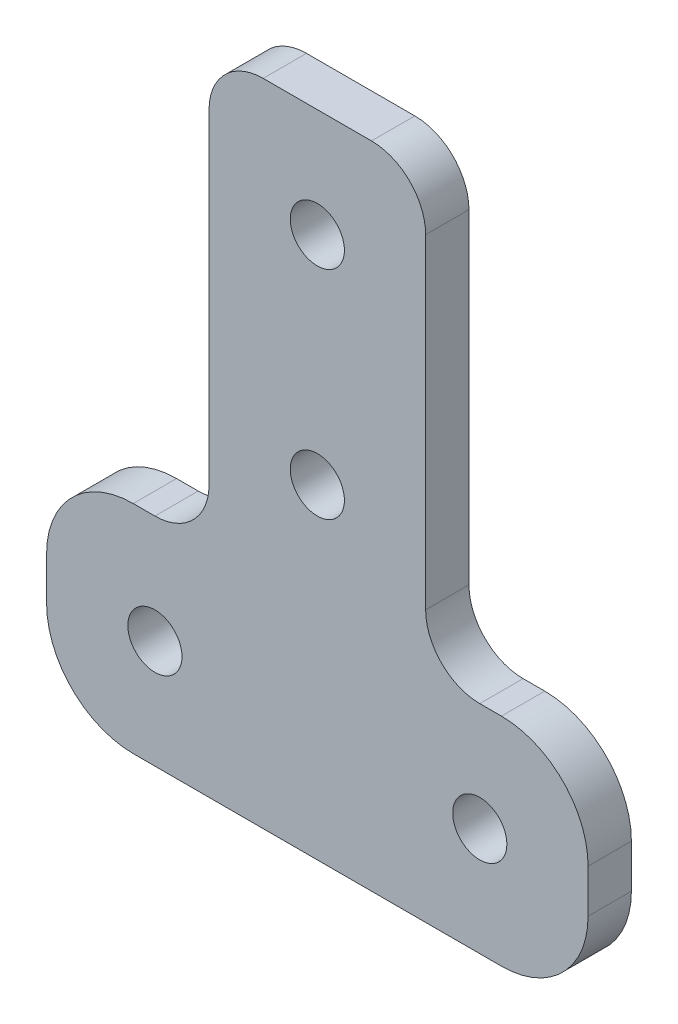
ISO-10303-21;
HEADER;
FILE_DESCRIPTION(('STEP AP214'),'2;1');
FILE_NAME('part.step','',(''),(''),'','','');
FILE_SCHEMA(('AUTOMOTIVE_DESIGN { 1 0 10303 214 1 1 1 1 }'));
ENDSEC;
DATA;
#1=APPLICATION_CONTEXT('core data for automotive mechanical design processes');
#2=APPLICATION_PROTOCOL_DEFINITION('international standard','automotive_design',2000,#1);
#3=PRODUCT_CONTEXT('',#1,'mechanical');
#4=PRODUCT('Part','Part','',(#3));
#5=PRODUCT_RELATED_PRODUCT_CATEGORY('part','',(#4));
#6=PRODUCT_DEFINITION_FORMATION('','',#4);
#7=PRODUCT_DEFINITION_CONTEXT('part definition',#1,'design');
#8=PRODUCT_DEFINITION('design','',#6,#7);
#9=PRODUCT_DEFINITION_SHAPE('','',#8);
#10=(LENGTH_UNIT() NAMED_UNIT(*) SI_UNIT(.MILLI.,.METRE.));
#11=(NAMED_UNIT(*) PLANE_ANGLE_UNIT() SI_UNIT($,.RADIAN.));
#12=(NAMED_UNIT(*) SI_UNIT($,.STERADIAN.) SOLID_ANGLE_UNIT());
#13=UNCERTAINTY_MEASURE_WITH_UNIT(LENGTH_MEASURE(1.E-05),#10,'distance_accuracy_value','');
#14=(GEOMETRIC_REPRESENTATION_CONTEXT(3) GLOBAL_UNCERTAINTY_ASSIGNED_CONTEXT((#13)) GLOBAL_UNIT_ASSIGNED_CONTEXT((#10,
#11,#12)) REPRESENTATION_CONTEXT('',''));
#15=CARTESIAN_POINT('',(0.,0.,0.));
#16=DIRECTION('',(0.,0.,1.));
#17=DIRECTION('',(1.,0.,0.));
#18=AXIS2_PLACEMENT_3D('',#15,#16,#17);
#19=CARTESIAN_POINT('',(0.,0.,4.));
#20=DIRECTION('',(0.,0.,-1.));
#21=DIRECTION('',(-1.,0.,0.));
#22=AXIS2_PLACEMENT_3D('',#19,#20,#21);
#23=PLANE('',#22);
#24=DIRECTION('',(1.,0.,0.));
#25=VECTOR('',#24,1.);
#26=CARTESIAN_POINT('',(25.,0.,4.));
#27=LINE('',#26,#25);
#28=CARTESIAN_POINT('',(-17.,0.,4.));
#29=VERTEX_POINT('',#28);
#30=CARTESIAN_POINT('',(17.,0.,4.));
#31=VERTEX_POINT('',#30);
#32=EDGE_CURVE('E214',#29,#31,#27,.T.);
#33=ORIENTED_EDGE('',*,*,#32,.T.);
#34=CARTESIAN_POINT('',(17.,7.99999999999999,4.));
#35=DIRECTION('',(0.,0.,-1.));
#36=DIRECTION('',(-1.,0.,0.));
#37=AXIS2_PLACEMENT_3D('',#34,#35,#36);
#38=CIRCLE('',#37,8.);
#39=CARTESIAN_POINT('',(25.,7.99999999999999,4.));
#40=VERTEX_POINT('',#39);
#41=EDGE_CURVE('E288',#31,#40,#38,.F.);
#42=ORIENTED_EDGE('',*,*,#41,.T.);
#43=DIRECTION('',(0.,1.,0.));
#44=VECTOR('',#43,1.);
#45=CARTESIAN_POINT('',(25.,20.,4.));
#46=LINE('',#45,#44);
#47=CARTESIAN_POINT('',(25.,12.,4.));
#48=VERTEX_POINT('',#47);
#49=EDGE_CURVE('E212',#40,#48,#46,.T.);
#50=ORIENTED_EDGE('',*,*,#49,.T.);
#51=CARTESIAN_POINT('',(17.,12.,4.));
#52=DIRECTION('',(0.,0.,-1.));
#53=DIRECTION('',(-1.,0.,0.));
#54=AXIS2_PLACEMENT_3D('',#51,#52,#53);
#55=CIRCLE('',#54,8.);
#56=CARTESIAN_POINT('',(17.,20.,4.));
#57=VERTEX_POINT('',#56);
#58=EDGE_CURVE('E55',#48,#57,#55,.F.);
#59=ORIENTED_EDGE('',*,*,#58,.T.);
#60=DIRECTION('',(-1.,0.,0.));
#61=VECTOR('',#60,1.);
#62=CARTESIAN_POINT('',(10.,20.,4.));
#63=LINE('',#62,#61);
#64=CARTESIAN_POINT('',(15.,20.,4.));
#65=VERTEX_POINT('',#64);
#66=EDGE_CURVE('E319',#57,#65,#63,.T.);
#67=ORIENTED_EDGE('',*,*,#66,.T.);
#68=CARTESIAN_POINT('',(15.,25.,4.));
#69=DIRECTION('',(0.,0.,-1.));
#70=DIRECTION('',(-1.,0.,0.));
#71=AXIS2_PLACEMENT_3D('',#68,#69,#70);
#72=CIRCLE('',#71,5.);
#73=CARTESIAN_POINT('',(10.,25.,4.));
#74=VERTEX_POINT('',#73);
#75=EDGE_CURVE('E166',#65,#74,#72,.T.);
#76=ORIENTED_EDGE('',*,*,#75,.T.);
#77=DIRECTION('',(0.,1.,0.));
#78=VECTOR('',#77,1.);
#79=CARTESIAN_POINT('',(10.,60.,4.));
#80=LINE('',#79,#78);
#81=CARTESIAN_POINT('',(10.,55.,4.));
#82=VERTEX_POINT('',#81);
#83=EDGE_CURVE('E176',#74,#82,#80,.T.);
#84=ORIENTED_EDGE('',*,*,#83,.T.);
#85=CARTESIAN_POINT('',(5.,55.,4.));
#86=DIRECTION('',(0.,0.,-1.));
#87=DIRECTION('',(-1.,0.,0.));
#88=AXIS2_PLACEMENT_3D('',#85,#86,#87);
#89=CIRCLE('',#88,5.);
#90=CARTESIAN_POINT('',(4.99999999999999,60.,4.));
#91=VERTEX_POINT('',#90);
#92=EDGE_CURVE('E233',#82,#91,#89,.F.);
#93=ORIENTED_EDGE('',*,*,#92,.T.);
#94=DIRECTION('',(-1.,0.,0.));
#95=VECTOR('',#94,1.);
#96=CARTESIAN_POINT('',(-10.,60.,4.));
#97=LINE('',#96,#95);
#98=CARTESIAN_POINT('',(-5.00000000000001,60.,4.));
#99=VERTEX_POINT('',#98);
#100=EDGE_CURVE('E313',#91,#99,#97,.T.);
#101=ORIENTED_EDGE('',*,*,#100,.T.);
#102=CARTESIAN_POINT('',(-5.,55.,4.));
#103=DIRECTION('',(0.,0.,-1.));
#104=DIRECTION('',(-1.,0.,0.));
#105=AXIS2_PLACEMENT_3D('',#102,#103,#104);
#106=CIRCLE('',#105,5.);
#107=CARTESIAN_POINT('',(-10.,55.,4.));
#108=VERTEX_POINT('',#107);
#109=EDGE_CURVE('E230',#99,#108,#106,.F.);
#110=ORIENTED_EDGE('',*,*,#109,.T.);
#111=DIRECTION('',(0.,-1.,0.));
#112=VECTOR('',#111,1.);
#113=CARTESIAN_POINT('',(-10.,60.,4.));
#114=LINE('',#113,#112);
#115=CARTESIAN_POINT('',(-10.,25.,4.));
#116=VERTEX_POINT('',#115);
#117=EDGE_CURVE('E309',#108,#116,#114,.T.);
#118=ORIENTED_EDGE('',*,*,#117,.T.);
#119=CARTESIAN_POINT('',(-15.,25.,4.));
#120=DIRECTION('',(0.,0.,-1.));
#121=DIRECTION('',(-1.,0.,0.));
#122=AXIS2_PLACEMENT_3D('',#119,#120,#121);
#123=CIRCLE('',#122,5.);
#124=CARTESIAN_POINT('',(-15.,20.,4.));
#125=VERTEX_POINT('',#124);
#126=EDGE_CURVE('E251',#116,#125,#123,.T.);
#127=ORIENTED_EDGE('',*,*,#126,.T.);
#128=DIRECTION('',(-1.,0.,0.));
#129=VECTOR('',#128,1.);
#130=CARTESIAN_POINT('',(-10.,20.,4.));
#131=LINE('',#130,#129);
#132=CARTESIAN_POINT('',(-17.,20.,4.));
#133=VERTEX_POINT('',#132);
#134=EDGE_CURVE('E305',#125,#133,#131,.T.);
#135=ORIENTED_EDGE('',*,*,#134,.T.);
#136=CARTESIAN_POINT('',(-17.,12.,4.));
#137=DIRECTION('',(0.,0.,-1.));
#138=DIRECTION('',(-1.,0.,0.));
#139=AXIS2_PLACEMENT_3D('',#136,#137,#138);
#140=CIRCLE('',#139,8.);
#141=CARTESIAN_POINT('',(-25.,12.,4.));
#142=VERTEX_POINT('',#141);
#143=EDGE_CURVE('E280',#133,#142,#140,.F.);
#144=ORIENTED_EDGE('',*,*,#143,.T.);
#145=DIRECTION('',(0.,-1.,0.));
#146=VECTOR('',#145,1.);
#147=CARTESIAN_POINT('',(-25.,20.,4.));
#148=LINE('',#147,#146);
#149=CARTESIAN_POINT('',(-25.,7.99999999999999,4.));
#150=VERTEX_POINT('',#149);
#151=EDGE_CURVE('E302',#142,#150,#148,.T.);
#152=ORIENTED_EDGE('',*,*,#151,.T.);
#153=CARTESIAN_POINT('',(-17.,7.99999999999999,4.));
#154=DIRECTION('',(0.,0.,-1.));
#155=DIRECTION('',(-1.,0.,0.));
#156=AXIS2_PLACEMENT_3D('',#153,#154,#155);
#157=CIRCLE('',#156,8.);
#158=EDGE_CURVE('E283',#150,#29,#157,.F.);
#159=ORIENTED_EDGE('',*,*,#158,.T.);
#160=EDGE_LOOP('',(#33,#42,#50,#59,#67,#76,#84,#93,#101,#110,#118,#127,#135,#144,#152,#159));
#161=FACE_BOUND('',#160,.T.);
#162=CARTESIAN_POINT('',(0.,50.,4.));
#163=DIRECTION('',(0.,0.,1.));
#164=DIRECTION('',(1.,0.,0.));
#165=AXIS2_PLACEMENT_3D('',#162,#163,#164);
#166=CIRCLE('',#165,2.5);
#167=CARTESIAN_POINT('',(2.5,50.,4.));
#168=VERTEX_POINT('',#167);
#169=EDGE_CURVE('E330',#168,#168,#166,.T.);
#170=ORIENTED_EDGE('',*,*,#169,.F.);
#171=EDGE_LOOP('',(#170));
#172=FACE_BOUND('',#171,.T.);
#173=CARTESIAN_POINT('',(0.,30.,4.));
#174=DIRECTION('',(0.,0.,1.));
#175=DIRECTION('',(1.,0.,0.));
#176=AXIS2_PLACEMENT_3D('',#173,#174,#175);
#177=CIRCLE('',#176,2.5);
#178=CARTESIAN_POINT('',(2.5,30.,4.));
#179=VERTEX_POINT('',#178);
#180=EDGE_CURVE('E339',#179,#179,#177,.T.);
#181=ORIENTED_EDGE('',*,*,#180,.F.);
#182=EDGE_LOOP('',(#181));
#183=FACE_BOUND('',#182,.T.);
#184=CARTESIAN_POINT('',(15.,10.,4.));
#185=DIRECTION('',(0.,0.,1.));
#186=DIRECTION('',(1.,0.,0.));
#187=AXIS2_PLACEMENT_3D('',#184,#185,#186);
#188=CIRCLE('',#187,2.5);
#189=CARTESIAN_POINT('',(17.5,10.,4.));
#190=VERTEX_POINT('',#189);
#191=EDGE_CURVE('E345',#190,#190,#188,.T.);
#192=ORIENTED_EDGE('',*,*,#191,.F.);
#193=EDGE_LOOP('',(#192));
#194=FACE_BOUND('',#193,.T.);
#195=CARTESIAN_POINT('',(-15.,9.99999999999999,4.));
#196=DIRECTION('',(0.,0.,1.));
#197=DIRECTION('',(1.,0.,0.));
#198=AXIS2_PLACEMENT_3D('',#195,#196,#197);
#199=CIRCLE('',#198,2.5);
#200=CARTESIAN_POINT('',(-12.5,9.99999999999999,4.));
#201=VERTEX_POINT('',#200);
#202=EDGE_CURVE('E353',#201,#201,#199,.T.);
#203=ORIENTED_EDGE('',*,*,#202,.F.);
#204=EDGE_LOOP('',(#203));
#205=FACE_BOUND('',#204,.T.);
#206=ADVANCED_FACE('F39',(#161,#172,#183,#194,#205),#23,.F.);
#207=CARTESIAN_POINT('',(0.,0.,0.));
#208=DIRECTION('',(0.,0.,-1.));
#209=DIRECTION('',(-1.,0.,0.));
#210=AXIS2_PLACEMENT_3D('',#207,#208,#209);
#211=PLANE('',#210);
#212=CARTESIAN_POINT('',(15.,10.,0.));
#213=DIRECTION('',(0.,0.,1.));
#214=DIRECTION('',(1.,0.,0.));
#215=AXIS2_PLACEMENT_3D('',#212,#213,#214);
#216=CIRCLE('',#215,2.5);
#217=CARTESIAN_POINT('',(17.5,10.,0.));
#218=VERTEX_POINT('',#217);
#219=EDGE_CURVE('E349',#218,#218,#216,.T.);
#220=ORIENTED_EDGE('',*,*,#219,.T.);
#221=EDGE_LOOP('',(#220));
#222=FACE_BOUND('',#221,.T.);
#223=CARTESIAN_POINT('',(0.,50.,0.));
#224=DIRECTION('',(0.,0.,1.));
#225=DIRECTION('',(1.,0.,0.));
#226=AXIS2_PLACEMENT_3D('',#223,#224,#225);
#227=CIRCLE('',#226,2.5);
#228=CARTESIAN_POINT('',(2.5,50.,0.));
#229=VERTEX_POINT('',#228);
#230=EDGE_CURVE('E326',#229,#229,#227,.T.);
#231=ORIENTED_EDGE('',*,*,#230,.T.);
#232=EDGE_LOOP('',(#231));
#233=FACE_BOUND('',#232,.T.);
#234=DIRECTION('',(0.,1.,0.));
#235=VECTOR('',#234,1.);
#236=CARTESIAN_POINT('',(25.,20.,0.));
#237=LINE('',#236,#235);
#238=CARTESIAN_POINT('',(25.,7.99999999999999,0.));
#239=VERTEX_POINT('',#238);
#240=CARTESIAN_POINT('',(25.,12.,0.));
#241=VERTEX_POINT('',#240);
#242=EDGE_CURVE('E194',#239,#241,#237,.T.);
#243=ORIENTED_EDGE('',*,*,#242,.F.);
#244=CARTESIAN_POINT('',(17.,7.99999999999999,0.));
#245=DIRECTION('',(0.,0.,-1.));
#246=DIRECTION('',(-1.,0.,0.));
#247=AXIS2_PLACEMENT_3D('',#244,#245,#246);
#248=CIRCLE('',#247,8.);
#249=CARTESIAN_POINT('',(17.,0.,0.));
#250=VERTEX_POINT('',#249);
#251=EDGE_CURVE('E270',#239,#250,#248,.T.);
#252=ORIENTED_EDGE('',*,*,#251,.T.);
#253=DIRECTION('',(1.,0.,0.));
#254=VECTOR('',#253,1.);
#255=CARTESIAN_POINT('',(25.,0.,0.));
#256=LINE('',#255,#254);
#257=CARTESIAN_POINT('',(-17.,0.,0.));
#258=VERTEX_POINT('',#257);
#259=EDGE_CURVE('E208',#258,#250,#256,.T.);
#260=ORIENTED_EDGE('',*,*,#259,.F.);
#261=CARTESIAN_POINT('',(-17.,7.99999999999999,0.));
#262=DIRECTION('',(0.,0.,-1.));
#263=DIRECTION('',(-1.,0.,0.));
#264=AXIS2_PLACEMENT_3D('',#261,#262,#263);
#265=CIRCLE('',#264,8.);
#266=CARTESIAN_POINT('',(-25.,7.99999999999999,0.));
#267=VERTEX_POINT('',#266);
#268=EDGE_CURVE('E264',#258,#267,#265,.T.);
#269=ORIENTED_EDGE('',*,*,#268,.T.);
#270=DIRECTION('',(0.,-1.,0.));
#271=VECTOR('',#270,1.);
#272=CARTESIAN_POINT('',(-25.,20.,0.));
#273=LINE('',#272,#271);
#274=CARTESIAN_POINT('',(-25.,12.,0.));
#275=VERTEX_POINT('',#274);
#276=EDGE_CURVE('E205',#275,#267,#273,.T.);
#277=ORIENTED_EDGE('',*,*,#276,.F.);
#278=CARTESIAN_POINT('',(-17.,12.,0.));
#279=DIRECTION('',(0.,0.,-1.));
#280=DIRECTION('',(-1.,0.,0.));
#281=AXIS2_PLACEMENT_3D('',#278,#279,#280);
#282=CIRCLE('',#281,8.);
#283=CARTESIAN_POINT('',(-17.,20.,0.));
#284=VERTEX_POINT('',#283);
#285=EDGE_CURVE('E261',#275,#284,#282,.T.);
#286=ORIENTED_EDGE('',*,*,#285,.T.);
#287=DIRECTION('',(-1.,0.,0.));
#288=VECTOR('',#287,1.);
#289=CARTESIAN_POINT('',(-10.,20.,0.));
#290=LINE('',#289,#288);
#291=CARTESIAN_POINT('',(-15.,20.,0.));
#292=VERTEX_POINT('',#291);
#293=EDGE_CURVE('E201',#292,#284,#290,.T.);
#294=ORIENTED_EDGE('',*,*,#293,.F.);
#295=CARTESIAN_POINT('',(-15.,25.,0.));
#296=DIRECTION('',(0.,0.,-1.));
#297=DIRECTION('',(-1.,0.,0.));
#298=AXIS2_PLACEMENT_3D('',#295,#296,#297);
#299=CIRCLE('',#298,5.);
#300=CARTESIAN_POINT('',(-10.,25.,0.));
#301=VERTEX_POINT('',#300);
#302=EDGE_CURVE('E248',#292,#301,#299,.F.);
#303=ORIENTED_EDGE('',*,*,#302,.T.);
#304=DIRECTION('',(0.,-1.,0.));
#305=VECTOR('',#304,1.);
#306=CARTESIAN_POINT('',(-10.,60.,0.));
#307=LINE('',#306,#305);
#308=CARTESIAN_POINT('',(-10.,55.,0.));
#309=VERTEX_POINT('',#308);
#310=EDGE_CURVE('E192',#309,#301,#307,.T.);
#311=ORIENTED_EDGE('',*,*,#310,.F.);
#312=CARTESIAN_POINT('',(-5.,55.,0.));
#313=DIRECTION('',(0.,0.,-1.));
#314=DIRECTION('',(-1.,0.,0.));
#315=AXIS2_PLACEMENT_3D('',#312,#313,#314);
#316=CIRCLE('',#315,5.);
#317=CARTESIAN_POINT('',(-5.00000000000001,60.,0.));
#318=VERTEX_POINT('',#317);
#319=EDGE_CURVE('E225',#309,#318,#316,.T.);
#320=ORIENTED_EDGE('',*,*,#319,.T.);
#321=DIRECTION('',(-1.,0.,0.));
#322=VECTOR('',#321,1.);
#323=CARTESIAN_POINT('',(-10.,60.,0.));
#324=LINE('',#323,#322);
#325=CARTESIAN_POINT('',(4.99999999999999,60.,0.));
#326=VERTEX_POINT('',#325);
#327=EDGE_CURVE('E186',#326,#318,#324,.T.);
#328=ORIENTED_EDGE('',*,*,#327,.F.);
#329=CARTESIAN_POINT('',(5.,55.,0.));
#330=DIRECTION('',(0.,0.,-1.));
#331=DIRECTION('',(-1.,0.,0.));
#332=AXIS2_PLACEMENT_3D('',#329,#330,#331);
#333=CIRCLE('',#332,5.);
#334=CARTESIAN_POINT('',(10.,55.,0.));
#335=VERTEX_POINT('',#334);
#336=EDGE_CURVE('E184',#326,#335,#333,.T.);
#337=ORIENTED_EDGE('',*,*,#336,.T.);
#338=DIRECTION('',(0.,1.,0.));
#339=VECTOR('',#338,1.);
#340=CARTESIAN_POINT('',(10.,60.,0.));
#341=LINE('',#340,#339);
#342=CARTESIAN_POINT('',(10.,25.,0.));
#343=VERTEX_POINT('',#342);
#344=EDGE_CURVE('E173',#343,#335,#341,.T.);
#345=ORIENTED_EDGE('',*,*,#344,.F.);
#346=CARTESIAN_POINT('',(15.,25.,0.));
#347=DIRECTION('',(0.,0.,-1.));
#348=DIRECTION('',(-1.,0.,0.));
#349=AXIS2_PLACEMENT_3D('',#346,#347,#348);
#350=CIRCLE('',#349,5.);
#351=CARTESIAN_POINT('',(15.,20.,0.));
#352=VERTEX_POINT('',#351);
#353=EDGE_CURVE('E155',#343,#352,#350,.F.);
#354=ORIENTED_EDGE('',*,*,#353,.T.);
#355=DIRECTION('',(-1.,0.,0.));
#356=VECTOR('',#355,1.);
#357=CARTESIAN_POINT('',(10.,20.,0.));
#358=LINE('',#357,#356);
#359=CARTESIAN_POINT('',(17.,20.,0.));
#360=VERTEX_POINT('',#359);
#361=EDGE_CURVE('E187',#360,#352,#358,.T.);
#362=ORIENTED_EDGE('',*,*,#361,.F.);
#363=CARTESIAN_POINT('',(17.,12.,0.));
#364=DIRECTION('',(0.,0.,-1.));
#365=DIRECTION('',(-1.,0.,0.));
#366=AXIS2_PLACEMENT_3D('',#363,#364,#365);
#367=CIRCLE('',#366,8.);
#368=EDGE_CURVE('E267',#360,#241,#367,.T.);
#369=ORIENTED_EDGE('',*,*,#368,.T.);
#370=EDGE_LOOP('',(#243,#252,#260,#269,#277,#286,#294,#303,#311,#320,#328,#337,#345,#354,#362,#369));
#371=FACE_BOUND('',#370,.T.);
#372=CARTESIAN_POINT('',(0.,30.,0.));
#373=DIRECTION('',(0.,0.,1.));
#374=DIRECTION('',(1.,0.,0.));
#375=AXIS2_PLACEMENT_3D('',#372,#373,#374);
#376=CIRCLE('',#375,2.5);
#377=CARTESIAN_POINT('',(2.5,30.,0.));
#378=VERTEX_POINT('',#377);
#379=EDGE_CURVE('E341',#378,#378,#376,.T.);
#380=ORIENTED_EDGE('',*,*,#379,.T.);
#381=EDGE_LOOP('',(#380));
#382=FACE_BOUND('',#381,.T.);
#383=CARTESIAN_POINT('',(-15.,9.99999999999999,0.));
#384=DIRECTION('',(0.,0.,1.));
#385=DIRECTION('',(1.,0.,0.));
#386=AXIS2_PLACEMENT_3D('',#383,#384,#385);
#387=CIRCLE('',#386,2.5);
#388=CARTESIAN_POINT('',(-12.5,9.99999999999999,0.));
#389=VERTEX_POINT('',#388);
#390=EDGE_CURVE('E357',#389,#389,#387,.T.);
#391=ORIENTED_EDGE('',*,*,#390,.T.);
#392=EDGE_LOOP('',(#391));
#393=FACE_BOUND('',#392,.T.);
#394=ADVANCED_FACE('F181',(#222,#233,#371,#382,#393),#211,.T.);
#395=CARTESIAN_POINT('',(25.,20.,4.));
#396=DIRECTION('',(-1.,0.,0.));
#397=DIRECTION('',(0.,-1.,0.));
#398=AXIS2_PLACEMENT_3D('',#395,#396,#397);
#399=PLANE('',#398);
#400=ORIENTED_EDGE('',*,*,#49,.F.);
#401=DIRECTION('',(0.,0.,-1.));
#402=VECTOR('',#401,1.);
#403=CARTESIAN_POINT('',(25.,7.99999999999999,4.));
#404=LINE('',#403,#402);
#405=EDGE_CURVE('E257',#40,#239,#404,.T.);
#406=ORIENTED_EDGE('',*,*,#405,.T.);
#407=ORIENTED_EDGE('',*,*,#242,.T.);
#408=DIRECTION('',(0.,0.,-1.));
#409=VECTOR('',#408,1.);
#410=CARTESIAN_POINT('',(25.,12.,4.));
#411=LINE('',#410,#409);
#412=EDGE_CURVE('E254',#241,#48,#411,.F.);
#413=ORIENTED_EDGE('',*,*,#412,.T.);
#414=EDGE_LOOP('',(#400,#406,#407,#413));
#415=FACE_BOUND('',#414,.T.);
#416=ADVANCED_FACE('F373',(#415),#399,.F.);
#417=CARTESIAN_POINT('',(10.,20.,4.));
#418=DIRECTION('',(0.,-1.,0.));
#419=DIRECTION('',(0.,0.,-1.));
#420=AXIS2_PLACEMENT_3D('',#417,#418,#419);
#421=PLANE('',#420);
#422=ORIENTED_EDGE('',*,*,#66,.F.);
#423=DIRECTION('',(0.,0.,-1.));
#424=VECTOR('',#423,1.);
#425=CARTESIAN_POINT('',(17.,20.,4.));
#426=LINE('',#425,#424);
#427=EDGE_CURVE('E291',#57,#360,#426,.T.);
#428=ORIENTED_EDGE('',*,*,#427,.T.);
#429=ORIENTED_EDGE('',*,*,#361,.T.);
#430=DIRECTION('',(0.,0.,-1.));
#431=VECTOR('',#430,1.);
#432=CARTESIAN_POINT('',(15.,20.,4.));
#433=LINE('',#432,#431);
#434=EDGE_CURVE('E161',#352,#65,#433,.F.);
#435=ORIENTED_EDGE('',*,*,#434,.T.);
#436=EDGE_LOOP('',(#422,#428,#429,#435));
#437=FACE_BOUND('',#436,.T.);
#438=ADVANCED_FACE('F402',(#437),#421,.F.);
#439=CARTESIAN_POINT('',(10.,60.,4.));
#440=DIRECTION('',(-1.,0.,0.));
#441=DIRECTION('',(0.,-1.,0.));
#442=AXIS2_PLACEMENT_3D('',#439,#440,#441);
#443=PLANE('',#442);
#444=ORIENTED_EDGE('',*,*,#83,.F.);
#445=DIRECTION('',(0.,0.,-1.));
#446=VECTOR('',#445,1.);
#447=CARTESIAN_POINT('',(10.,25.,0.));
#448=LINE('',#447,#446);
#449=EDGE_CURVE('E159',#74,#343,#448,.T.);
#450=ORIENTED_EDGE('',*,*,#449,.T.);
#451=ORIENTED_EDGE('',*,*,#344,.T.);
#452=DIRECTION('',(0.,0.,-1.));
#453=VECTOR('',#452,1.);
#454=CARTESIAN_POINT('',(10.,55.,4.));
#455=LINE('',#454,#453);
#456=EDGE_CURVE('E178',#335,#82,#455,.F.);
#457=ORIENTED_EDGE('',*,*,#456,.T.);
#458=EDGE_LOOP('',(#444,#450,#451,#457));
#459=FACE_BOUND('',#458,.T.);
#460=ADVANCED_FACE('F172',(#459),#443,.F.);
#461=CARTESIAN_POINT('',(-10.,60.,4.));
#462=DIRECTION('',(0.,-1.,0.));
#463=DIRECTION('',(1.,0.,0.));
#464=AXIS2_PLACEMENT_3D('',#461,#462,#463);
#465=PLANE('',#464);
#466=ORIENTED_EDGE('',*,*,#100,.F.);
#467=DIRECTION('',(0.,0.,-1.));
#468=VECTOR('',#467,1.);
#469=CARTESIAN_POINT('',(4.99999999999999,60.,4.));
#470=LINE('',#469,#468);
#471=EDGE_CURVE('E221',#91,#326,#470,.T.);
#472=ORIENTED_EDGE('',*,*,#471,.T.);
#473=ORIENTED_EDGE('',*,*,#327,.T.);
#474=DIRECTION('',(0.,0.,-1.));
#475=VECTOR('',#474,1.);
#476=CARTESIAN_POINT('',(-5.00000000000001,60.,4.));
#477=LINE('',#476,#475);
#478=EDGE_CURVE('E218',#318,#99,#477,.F.);
#479=ORIENTED_EDGE('',*,*,#478,.T.);
#480=EDGE_LOOP('',(#466,#472,#473,#479));
#481=FACE_BOUND('',#480,.T.);
#482=ADVANCED_FACE('F395',(#481),#465,.F.);
#483=CARTESIAN_POINT('',(-10.,60.,4.));
#484=DIRECTION('',(1.,0.,0.));
#485=DIRECTION('',(0.,1.,0.));
#486=AXIS2_PLACEMENT_3D('',#483,#484,#485);
#487=PLANE('',#486);
#488=ORIENTED_EDGE('',*,*,#117,.F.);
#489=DIRECTION('',(0.,0.,-1.));
#490=VECTOR('',#489,1.);
#491=CARTESIAN_POINT('',(-10.,55.,4.));
#492=LINE('',#491,#490);
#493=EDGE_CURVE('E239',#108,#309,#492,.T.);
#494=ORIENTED_EDGE('',*,*,#493,.T.);
#495=ORIENTED_EDGE('',*,*,#310,.T.);
#496=DIRECTION('',(0.,0.,-1.));
#497=VECTOR('',#496,1.);
#498=CARTESIAN_POINT('',(-10.,25.,4.));
#499=LINE('',#498,#497);
#500=EDGE_CURVE('E236',#301,#116,#499,.F.);
#501=ORIENTED_EDGE('',*,*,#500,.T.);
#502=EDGE_LOOP('',(#488,#494,#495,#501));
#503=FACE_BOUND('',#502,.T.);
#504=ADVANCED_FACE('F391',(#503),#487,.F.);
#505=CARTESIAN_POINT('',(-10.,20.,4.));
#506=DIRECTION('',(0.,-1.,0.));
#507=DIRECTION('',(1.,0.,0.));
#508=AXIS2_PLACEMENT_3D('',#505,#506,#507);
#509=PLANE('',#508);
#510=ORIENTED_EDGE('',*,*,#293,.T.);
#511=DIRECTION('',(0.,0.,-1.));
#512=VECTOR('',#511,1.);
#513=CARTESIAN_POINT('',(-17.,20.,4.));
#514=LINE('',#513,#512);
#515=EDGE_CURVE('E11',#284,#133,#514,.F.);
#516=ORIENTED_EDGE('',*,*,#515,.T.);
#517=ORIENTED_EDGE('',*,*,#134,.F.);
#518=DIRECTION('',(0.,0.,-1.));
#519=VECTOR('',#518,1.);
#520=CARTESIAN_POINT('',(-15.,20.,0.));
#521=LINE('',#520,#519);
#522=EDGE_CURVE('E167',#125,#292,#521,.T.);
#523=ORIENTED_EDGE('',*,*,#522,.T.);
#524=EDGE_LOOP('',(#510,#516,#517,#523));
#525=FACE_BOUND('',#524,.T.);
#526=ADVANCED_FACE('F388',(#525),#509,.F.);
#527=CARTESIAN_POINT('',(-25.,20.,4.));
#528=DIRECTION('',(1.,0.,0.));
#529=DIRECTION('',(0.,1.,0.));
#530=AXIS2_PLACEMENT_3D('',#527,#528,#529);
#531=PLANE('',#530);
#532=ORIENTED_EDGE('',*,*,#276,.T.);
#533=DIRECTION('',(0.,0.,-1.));
#534=VECTOR('',#533,1.);
#535=CARTESIAN_POINT('',(-25.,7.99999999999999,4.));
#536=LINE('',#535,#534);
#537=EDGE_CURVE('E48',#267,#150,#536,.F.);
#538=ORIENTED_EDGE('',*,*,#537,.T.);
#539=ORIENTED_EDGE('',*,*,#151,.F.);
#540=DIRECTION('',(0.,0.,-1.));
#541=VECTOR('',#540,1.);
#542=CARTESIAN_POINT('',(-25.,12.,4.));
#543=LINE('',#542,#541);
#544=EDGE_CURVE('E295',#142,#275,#543,.T.);
#545=ORIENTED_EDGE('',*,*,#544,.T.);
#546=EDGE_LOOP('',(#532,#538,#539,#545));
#547=FACE_BOUND('',#546,.T.);
#548=ADVANCED_FACE('F384',(#547),#531,.F.);
#549=CARTESIAN_POINT('',(25.,0.,4.));
#550=DIRECTION('',(0.,1.,0.));
#551=DIRECTION('',(0.,0.,1.));
#552=AXIS2_PLACEMENT_3D('',#549,#550,#551);
#553=PLANE('',#552);
#554=ORIENTED_EDGE('',*,*,#259,.T.);
#555=DIRECTION('',(0.,0.,-1.));
#556=VECTOR('',#555,1.);
#557=CARTESIAN_POINT('',(17.,0.,4.));
#558=LINE('',#557,#556);
#559=EDGE_CURVE('E277',#250,#31,#558,.F.);
#560=ORIENTED_EDGE('',*,*,#559,.T.);
#561=ORIENTED_EDGE('',*,*,#32,.F.);
#562=DIRECTION('',(0.,0.,-1.));
#563=VECTOR('',#562,1.);
#564=CARTESIAN_POINT('',(-17.,0.,4.));
#565=LINE('',#564,#563);
#566=EDGE_CURVE('E273',#29,#258,#565,.T.);
#567=ORIENTED_EDGE('',*,*,#566,.T.);
#568=EDGE_LOOP('',(#554,#560,#561,#567));
#569=FACE_BOUND('',#568,.T.);
#570=ADVANCED_FACE('F381',(#569),#553,.F.);
#571=CARTESIAN_POINT('',(0.,50.,4.));
#572=DIRECTION('',(0.,0.,-1.));
#573=DIRECTION('',(-1.,0.,0.));
#574=AXIS2_PLACEMENT_3D('',#571,#572,#573);
#575=CYLINDRICAL_SURFACE('',#574,2.5);
#576=ORIENTED_EDGE('',*,*,#169,.T.);
#577=EDGE_LOOP('',(#576));
#578=FACE_BOUND('',#577,.T.);
#579=ORIENTED_EDGE('',*,*,#230,.F.);
#580=EDGE_LOOP('',(#579));
#581=FACE_BOUND('',#580,.T.);
#582=ADVANCED_FACE('F378',(#578,#581),#575,.F.);
#583=CARTESIAN_POINT('',(0.,30.,4.));
#584=DIRECTION('',(0.,0.,-1.));
#585=DIRECTION('',(-1.,0.,0.));
#586=AXIS2_PLACEMENT_3D('',#583,#584,#585);
#587=CYLINDRICAL_SURFACE('',#586,2.5);
#588=ORIENTED_EDGE('',*,*,#180,.T.);
#589=EDGE_LOOP('',(#588));
#590=FACE_BOUND('',#589,.T.);
#591=ORIENTED_EDGE('',*,*,#379,.F.);
#592=EDGE_LOOP('',(#591));
#593=FACE_BOUND('',#592,.T.);
#594=ADVANCED_FACE('F581',(#590,#593),#587,.F.);
#595=CARTESIAN_POINT('',(15.,10.,4.));
#596=DIRECTION('',(0.,0.,-1.));
#597=DIRECTION('',(-1.,0.,0.));
#598=AXIS2_PLACEMENT_3D('',#595,#596,#597);
#599=CYLINDRICAL_SURFACE('',#598,2.5);
#600=ORIENTED_EDGE('',*,*,#191,.T.);
#601=EDGE_LOOP('',(#600));
#602=FACE_BOUND('',#601,.T.);
#603=ORIENTED_EDGE('',*,*,#219,.F.);
#604=EDGE_LOOP('',(#603));
#605=FACE_BOUND('',#604,.T.);
#606=ADVANCED_FACE('F572',(#602,#605),#599,.F.);
#607=CARTESIAN_POINT('',(-15.,9.99999999999999,4.));
#608=DIRECTION('',(0.,0.,-1.));
#609=DIRECTION('',(-1.,0.,0.));
#610=AXIS2_PLACEMENT_3D('',#607,#608,#609);
#611=CYLINDRICAL_SURFACE('',#610,2.5);
#612=ORIENTED_EDGE('',*,*,#202,.T.);
#613=EDGE_LOOP('',(#612));
#614=FACE_BOUND('',#613,.T.);
#615=ORIENTED_EDGE('',*,*,#390,.F.);
#616=EDGE_LOOP('',(#615));
#617=FACE_BOUND('',#616,.T.);
#618=ADVANCED_FACE('F365',(#614,#617),#611,.F.);
#619=CARTESIAN_POINT('',(15.,25.,4.));
#620=DIRECTION('',(0.,0.,1.));
#621=DIRECTION('',(1.,0.,0.));
#622=AXIS2_PLACEMENT_3D('',#619,#620,#621);
#623=CYLINDRICAL_SURFACE('',#622,5.);
#624=ORIENTED_EDGE('',*,*,#75,.F.);
#625=ORIENTED_EDGE('',*,*,#434,.F.);
#626=ORIENTED_EDGE('',*,*,#353,.F.);
#627=ORIENTED_EDGE('',*,*,#449,.F.);
#628=EDGE_LOOP('',(#624,#625,#626,#627));
#629=FACE_BOUND('',#628,.T.);
#630=ADVANCED_FACE('F158',(#629),#623,.F.);
#631=CARTESIAN_POINT('',(5.,55.,4.));
#632=DIRECTION('',(0.,0.,-1.));
#633=DIRECTION('',(-1.,0.,0.));
#634=AXIS2_PLACEMENT_3D('',#631,#632,#633);
#635=CYLINDRICAL_SURFACE('',#634,5.);
#636=ORIENTED_EDGE('',*,*,#92,.F.);
#637=ORIENTED_EDGE('',*,*,#456,.F.);
#638=ORIENTED_EDGE('',*,*,#336,.F.);
#639=ORIENTED_EDGE('',*,*,#471,.F.);
#640=EDGE_LOOP('',(#636,#637,#638,#639));
#641=FACE_BOUND('',#640,.T.);
#642=ADVANCED_FACE('F410',(#641),#635,.T.);
#643=CARTESIAN_POINT('',(-5.,55.,4.));
#644=DIRECTION('',(0.,0.,-1.));
#645=DIRECTION('',(-1.,0.,0.));
#646=AXIS2_PLACEMENT_3D('',#643,#644,#645);
#647=CYLINDRICAL_SURFACE('',#646,5.);
#648=ORIENTED_EDGE('',*,*,#109,.F.);
#649=ORIENTED_EDGE('',*,*,#478,.F.);
#650=ORIENTED_EDGE('',*,*,#319,.F.);
#651=ORIENTED_EDGE('',*,*,#493,.F.);
#652=EDGE_LOOP('',(#648,#649,#650,#651));
#653=FACE_BOUND('',#652,.T.);
#654=ADVANCED_FACE('F413',(#653),#647,.T.);
#655=CARTESIAN_POINT('',(-15.,25.,4.));
#656=DIRECTION('',(0.,0.,1.));
#657=DIRECTION('',(1.,0.,0.));
#658=AXIS2_PLACEMENT_3D('',#655,#656,#657);
#659=CYLINDRICAL_SURFACE('',#658,5.);
#660=ORIENTED_EDGE('',*,*,#126,.F.);
#661=ORIENTED_EDGE('',*,*,#500,.F.);
#662=ORIENTED_EDGE('',*,*,#302,.F.);
#663=ORIENTED_EDGE('',*,*,#522,.F.);
#664=EDGE_LOOP('',(#660,#661,#662,#663));
#665=FACE_BOUND('',#664,.T.);
#666=ADVANCED_FACE('F417',(#665),#659,.F.);
#667=CARTESIAN_POINT('',(17.,7.99999999999999,4.));
#668=DIRECTION('',(0.,0.,-1.));
#669=DIRECTION('',(-1.,0.,0.));
#670=AXIS2_PLACEMENT_3D('',#667,#668,#669);
#671=CYLINDRICAL_SURFACE('',#670,8.);
#672=ORIENTED_EDGE('',*,*,#41,.F.);
#673=ORIENTED_EDGE('',*,*,#559,.F.);
#674=ORIENTED_EDGE('',*,*,#251,.F.);
#675=ORIENTED_EDGE('',*,*,#405,.F.);
#676=EDGE_LOOP('',(#672,#673,#674,#675));
#677=FACE_BOUND('',#676,.T.);
#678=ADVANCED_FACE('F421',(#677),#671,.T.);
#679=CARTESIAN_POINT('',(17.,12.,4.));
#680=DIRECTION('',(0.,0.,-1.));
#681=DIRECTION('',(-1.,0.,0.));
#682=AXIS2_PLACEMENT_3D('',#679,#680,#681);
#683=CYLINDRICAL_SURFACE('',#682,8.);
#684=ORIENTED_EDGE('',*,*,#58,.F.);
#685=ORIENTED_EDGE('',*,*,#412,.F.);
#686=ORIENTED_EDGE('',*,*,#368,.F.);
#687=ORIENTED_EDGE('',*,*,#427,.F.);
#688=EDGE_LOOP('',(#684,#685,#686,#687));
#689=FACE_BOUND('',#688,.T.);
#690=ADVANCED_FACE('F425',(#689),#683,.T.);
#691=CARTESIAN_POINT('',(-17.,7.99999999999999,4.));
#692=DIRECTION('',(0.,0.,-1.));
#693=DIRECTION('',(-1.,0.,0.));
#694=AXIS2_PLACEMENT_3D('',#691,#692,#693);
#695=CYLINDRICAL_SURFACE('',#694,8.);
#696=ORIENTED_EDGE('',*,*,#158,.F.);
#697=ORIENTED_EDGE('',*,*,#537,.F.);
#698=ORIENTED_EDGE('',*,*,#268,.F.);
#699=ORIENTED_EDGE('',*,*,#566,.F.);
#700=EDGE_LOOP('',(#696,#697,#698,#699));
#701=FACE_BOUND('',#700,.T.);
#702=ADVANCED_FACE('F428',(#701),#695,.T.);
#703=CARTESIAN_POINT('',(-17.,12.,4.));
#704=DIRECTION('',(0.,0.,-1.));
#705=DIRECTION('',(-1.,0.,0.));
#706=AXIS2_PLACEMENT_3D('',#703,#704,#705);
#707=CYLINDRICAL_SURFACE('',#706,8.);
#708=ORIENTED_EDGE('',*,*,#143,.F.);
#709=ORIENTED_EDGE('',*,*,#515,.F.);
#710=ORIENTED_EDGE('',*,*,#285,.F.);
#711=ORIENTED_EDGE('',*,*,#544,.F.);
#712=EDGE_LOOP('',(#708,#709,#710,#711));
#713=FACE_BOUND('',#712,.T.);
#714=ADVANCED_FACE('F41',(#713),#707,.T.);
#715=CLOSED_SHELL('',(#206,#394,#416,#438,#460,#482,#504,#526,#548,#570,#582,#594,#606,#618,
#630,#642,#654,#666,#678,#690,#702,#714));
#716=MANIFOLD_SOLID_BREP('B2',#715);
#717=ADVANCED_BREP_SHAPE_REPRESENTATION('',(#18,#716),#14);
#718=SHAPE_DEFINITION_REPRESENTATION(#9,#717);
ENDSEC;
END-ISO-10303-21;
